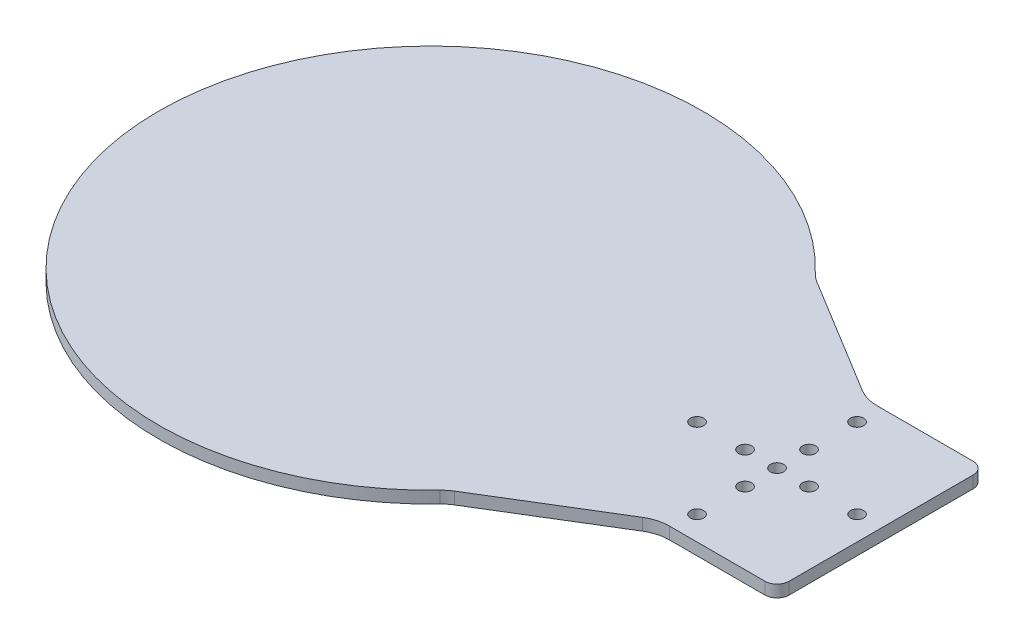
ISO-10303-21;
HEADER;
FILE_DESCRIPTION(('STEP AP214'),'2;1');
FILE_NAME('part.step','',(''),(''),'','','');
FILE_SCHEMA(('AUTOMOTIVE_DESIGN { 1 0 10303 214 1 1 1 1 }'));
ENDSEC;
DATA;
#1=APPLICATION_CONTEXT('core data for automotive mechanical design processes');
#2=APPLICATION_PROTOCOL_DEFINITION('international standard','automotive_design',2000,#1);
#3=PRODUCT_CONTEXT('',#1,'mechanical');
#4=PRODUCT('Part','Part','',(#3));
#5=PRODUCT_RELATED_PRODUCT_CATEGORY('part','',(#4));
#6=PRODUCT_DEFINITION_FORMATION('','',#4);
#7=PRODUCT_DEFINITION_CONTEXT('part definition',#1,'design');
#8=PRODUCT_DEFINITION('design','',#6,#7);
#9=PRODUCT_DEFINITION_SHAPE('','',#8);
#10=(LENGTH_UNIT() NAMED_UNIT(*) SI_UNIT(.MILLI.,.METRE.));
#11=(NAMED_UNIT(*) PLANE_ANGLE_UNIT() SI_UNIT($,.RADIAN.));
#12=(NAMED_UNIT(*) SI_UNIT($,.STERADIAN.) SOLID_ANGLE_UNIT());
#13=UNCERTAINTY_MEASURE_WITH_UNIT(LENGTH_MEASURE(1.E-05),#10,'distance_accuracy_value','');
#14=(GEOMETRIC_REPRESENTATION_CONTEXT(3) GLOBAL_UNCERTAINTY_ASSIGNED_CONTEXT((#13)) GLOBAL_UNIT_ASSIGNED_CONTEXT((#10,
#11,#12)) REPRESENTATION_CONTEXT('',''));
#15=CARTESIAN_POINT('',(0.,0.,0.));
#16=DIRECTION('',(0.,0.,1.));
#17=DIRECTION('',(1.,0.,0.));
#18=AXIS2_PLACEMENT_3D('',#15,#16,#17);
#19=CARTESIAN_POINT('',(0.,3.,0.));
#20=DIRECTION('',(0.,-1.,0.));
#21=DIRECTION('',(0.,0.,-1.));
#22=AXIS2_PLACEMENT_3D('',#19,#20,#21);
#23=CYLINDRICAL_SURFACE('',#22,68.);
#24=CARTESIAN_POINT('',(0.,0.,0.));
#25=DIRECTION('',(0.,1.,0.));
#26=DIRECTION('',(0.,0.,1.));
#27=AXIS2_PLACEMENT_3D('',#24,#25,#26);
#28=CIRCLE('',#27,68.);
#29=CARTESIAN_POINT('',(49.2133764276026,0.,-46.9259371839827));
#30=VERTEX_POINT('',#29);
#31=CARTESIAN_POINT('',(49.2133764276026,0.,46.9259371839827));
#32=VERTEX_POINT('',#31);
#33=EDGE_CURVE('E260',#30,#32,#28,.T.);
#34=ORIENTED_EDGE('',*,*,#33,.T.);
#35=DIRECTION('',(0.,-1.,0.));
#36=VECTOR('',#35,1.);
#37=CARTESIAN_POINT('',(49.2133764276026,3.,46.9259371839827));
#38=LINE('',#37,#36);
#39=CARTESIAN_POINT('',(49.2133764276026,3.,46.9259371839827));
#40=VERTEX_POINT('',#39);
#41=EDGE_CURVE('E186',#32,#40,#38,.F.);
#42=ORIENTED_EDGE('',*,*,#41,.T.);
#43=CARTESIAN_POINT('',(0.,3.,0.));
#44=DIRECTION('',(0.,1.,0.));
#45=DIRECTION('',(0.,0.,1.));
#46=AXIS2_PLACEMENT_3D('',#43,#44,#45);
#47=CIRCLE('',#46,68.);
#48=CARTESIAN_POINT('',(49.2133764276026,3.,-46.9259371839827));
#49=VERTEX_POINT('',#48);
#50=EDGE_CURVE('E145',#49,#40,#47,.T.);
#51=ORIENTED_EDGE('',*,*,#50,.F.);
#52=DIRECTION('',(0.,-1.,0.));
#53=VECTOR('',#52,1.);
#54=CARTESIAN_POINT('',(49.2133764276026,3.,-46.9259371839827));
#55=LINE('',#54,#53);
#56=EDGE_CURVE('E183',#49,#30,#55,.T.);
#57=ORIENTED_EDGE('',*,*,#56,.T.);
#58=EDGE_LOOP('',(#34,#42,#51,#57));
#59=FACE_BOUND('',#58,.T.);
#60=ADVANCED_FACE('F47',(#59),#23,.T.);
#61=CARTESIAN_POINT('',(62.83311228962,3.,-26.));
#62=DIRECTION('',(0.,0.,1.));
#63=DIRECTION('',(1.,0.,0.));
#64=AXIS2_PLACEMENT_3D('',#61,#62,#63);
#65=PLANE('',#64);
#66=DIRECTION('',(-1.,0.,0.));
#67=VECTOR('',#66,1.);
#68=CARTESIAN_POINT('',(62.83311228962,3.,-26.));
#69=LINE('',#68,#67);
#70=CARTESIAN_POINT('',(109.579,3.,-26.));
#71=VERTEX_POINT('',#70);
#72=CARTESIAN_POINT('',(85.6448705965521,3.,-26.));
#73=VERTEX_POINT('',#72);
#74=EDGE_CURVE('E169',#71,#73,#69,.T.);
#75=ORIENTED_EDGE('',*,*,#74,.F.);
#76=DIRECTION('',(0.,-1.,0.));
#77=VECTOR('',#76,1.);
#78=CARTESIAN_POINT('',(109.579,3.,-26.));
#79=LINE('',#78,#77);
#80=CARTESIAN_POINT('',(109.579,0.,-26.));
#81=VERTEX_POINT('',#80);
#82=EDGE_CURVE('E220',#71,#81,#79,.T.);
#83=ORIENTED_EDGE('',*,*,#82,.T.);
#84=DIRECTION('',(-1.,0.,0.));
#85=VECTOR('',#84,1.);
#86=CARTESIAN_POINT('',(62.83311228962,0.,-26.));
#87=LINE('',#86,#85);
#88=CARTESIAN_POINT('',(85.6448705965521,0.,-26.));
#89=VERTEX_POINT('',#88);
#90=EDGE_CURVE('E178',#81,#89,#87,.T.);
#91=ORIENTED_EDGE('',*,*,#90,.T.);
#92=DIRECTION('',(0.,1.,0.));
#93=VECTOR('',#92,1.);
#94=CARTESIAN_POINT('',(85.6448705965521,3.,-26.));
#95=LINE('',#94,#93);
#96=EDGE_CURVE('E196',#89,#73,#95,.T.);
#97=ORIENTED_EDGE('',*,*,#96,.T.);
#98=EDGE_LOOP('',(#75,#83,#91,#97));
#99=FACE_BOUND('',#98,.T.);
#100=ADVANCED_FACE('F245',(#99),#65,.F.);
#101=CARTESIAN_POINT('',(0.,3.,0.));
#102=DIRECTION('',(0.,1.,0.));
#103=DIRECTION('',(0.,0.,1.));
#104=AXIS2_PLACEMENT_3D('',#101,#102,#103);
#105=PLANE('',#104);
#106=DIRECTION('',(0.,0.,-1.));
#107=VECTOR('',#106,1.);
#108=CARTESIAN_POINT('',(112.579,3.,26.));
#109=LINE('',#108,#107);
#110=CARTESIAN_POINT('',(112.579,3.,23.));
#111=VERTEX_POINT('',#110);
#112=CARTESIAN_POINT('',(112.579,3.,-23.));
#113=VERTEX_POINT('',#112);
#114=EDGE_CURVE('E175',#111,#113,#109,.T.);
#115=ORIENTED_EDGE('',*,*,#114,.T.);
#116=CARTESIAN_POINT('',(109.579,3.,-23.));
#117=DIRECTION('',(0.,1.,0.));
#118=DIRECTION('',(0.,0.,1.));
#119=AXIS2_PLACEMENT_3D('',#116,#117,#118);
#120=CIRCLE('',#119,3.);
#121=EDGE_CURVE('E56',#113,#71,#120,.T.);
#122=ORIENTED_EDGE('',*,*,#121,.T.);
#123=ORIENTED_EDGE('',*,*,#74,.T.);
#124=CARTESIAN_POINT('',(85.6448705965521,3.,-36.));
#125=DIRECTION('',(0.,1.,0.));
#126=DIRECTION('',(0.,0.,1.));
#127=AXIS2_PLACEMENT_3D('',#124,#125,#126);
#128=CIRCLE('',#127,10.);
#129=CARTESIAN_POINT('',(80.4333741021672,3.,-27.4653468559634));
#130=VERTEX_POINT('',#129);
#131=EDGE_CURVE('E213',#73,#130,#128,.F.);
#132=ORIENTED_EDGE('',*,*,#131,.T.);
#133=DIRECTION('',(0.853465314403662,0.,0.521149649438488));
#134=VECTOR('',#133,1.);
#135=CARTESIAN_POINT('',(34.0615831304438,3.,-55.7812516747014));
#136=LINE('',#135,#134);
#137=CARTESIAN_POINT('',(51.2391411725711,3.,-45.2921571552377));
#138=VERTEX_POINT('',#137);
#139=EDGE_CURVE('E347',#138,#130,#136,.T.);
#140=ORIENTED_EDGE('',*,*,#139,.F.);
#141=CARTESIAN_POINT('',(56.4506376669559,3.,-53.8268102992743));
#142=DIRECTION('',(0.,1.,0.));
#143=DIRECTION('',(0.,0.,1.));
#144=AXIS2_PLACEMENT_3D('',#141,#142,#143);
#145=CIRCLE('',#144,10.);
#146=EDGE_CURVE('E207',#138,#49,#145,.F.);
#147=ORIENTED_EDGE('',*,*,#146,.T.);
#148=ORIENTED_EDGE('',*,*,#50,.T.);
#149=CARTESIAN_POINT('',(56.4506376669559,3.,53.8268102992743));
#150=DIRECTION('',(0.,1.,0.));
#151=DIRECTION('',(0.,0.,1.));
#152=AXIS2_PLACEMENT_3D('',#149,#150,#151);
#153=CIRCLE('',#152,10.);
#154=CARTESIAN_POINT('',(51.2391411725711,3.,45.2921571552377));
#155=VERTEX_POINT('',#154);
#156=EDGE_CURVE('E139',#40,#155,#153,.F.);
#157=ORIENTED_EDGE('',*,*,#156,.T.);
#158=DIRECTION('',(0.853465314403662,0.,-0.521149649438488));
#159=VECTOR('',#158,1.);
#160=CARTESIAN_POINT('',(34.0615831304438,3.,55.7812516747014));
#161=LINE('',#160,#159);
#162=CARTESIAN_POINT('',(80.4333741021672,3.,27.4653468559634));
#163=VERTEX_POINT('',#162);
#164=EDGE_CURVE('E143',#155,#163,#161,.T.);
#165=ORIENTED_EDGE('',*,*,#164,.T.);
#166=CARTESIAN_POINT('',(85.644870596552,3.,36.));
#167=DIRECTION('',(0.,1.,0.));
#168=DIRECTION('',(0.,0.,1.));
#169=AXIS2_PLACEMENT_3D('',#166,#167,#168);
#170=CIRCLE('',#169,10.);
#171=CARTESIAN_POINT('',(85.644870596552,3.,26.));
#172=VERTEX_POINT('',#171);
#173=EDGE_CURVE('E200',#163,#172,#170,.F.);
#174=ORIENTED_EDGE('',*,*,#173,.T.);
#175=DIRECTION('',(1.,0.,0.));
#176=VECTOR('',#175,1.);
#177=CARTESIAN_POINT('',(62.83311228962,3.,26.));
#178=LINE('',#177,#176);
#179=CARTESIAN_POINT('',(109.579,3.,26.));
#180=VERTEX_POINT('',#179);
#181=EDGE_CURVE('E269',#172,#180,#178,.T.);
#182=ORIENTED_EDGE('',*,*,#181,.T.);
#183=CARTESIAN_POINT('',(109.579,3.,23.));
#184=DIRECTION('',(0.,1.,0.));
#185=DIRECTION('',(0.,0.,1.));
#186=AXIS2_PLACEMENT_3D('',#183,#184,#185);
#187=CIRCLE('',#186,3.);
#188=EDGE_CURVE('E236',#180,#111,#187,.T.);
#189=ORIENTED_EDGE('',*,*,#188,.T.);
#190=EDGE_LOOP('',(#115,#122,#123,#132,#140,#147,#148,#157,#165,#174,#182,#189));
#191=FACE_BOUND('',#190,.T.);
#192=CARTESIAN_POINT('',(86.579,3.,-8.00000000000001));
#193=DIRECTION('',(0.,1.,0.));
#194=DIRECTION('',(0.,0.,1.));
#195=AXIS2_PLACEMENT_3D('',#192,#193,#194);
#196=CIRCLE('',#195,1.65);
#197=CARTESIAN_POINT('',(86.579,3.,-6.35));
#198=VERTEX_POINT('',#197);
#199=EDGE_CURVE('E326',#198,#198,#196,.T.);
#200=ORIENTED_EDGE('',*,*,#199,.F.);
#201=EDGE_LOOP('',(#200));
#202=FACE_BOUND('',#201,.T.);
#203=CARTESIAN_POINT('',(78.579,3.,0.));
#204=DIRECTION('',(0.,1.,0.));
#205=DIRECTION('',(0.,0.,1.));
#206=AXIS2_PLACEMENT_3D('',#203,#204,#205);
#207=CIRCLE('',#206,1.65);
#208=CARTESIAN_POINT('',(78.579,3.,1.65));
#209=VERTEX_POINT('',#208);
#210=EDGE_CURVE('E310',#209,#209,#207,.T.);
#211=ORIENTED_EDGE('',*,*,#210,.F.);
#212=EDGE_LOOP('',(#211));
#213=FACE_BOUND('',#212,.T.);
#214=CARTESIAN_POINT('',(86.579,3.,8.00000000000001));
#215=DIRECTION('',(0.,1.,0.));
#216=DIRECTION('',(0.,0.,1.));
#217=AXIS2_PLACEMENT_3D('',#214,#215,#216);
#218=CIRCLE('',#217,1.65);
#219=CARTESIAN_POINT('',(86.579,3.,9.65000000000001));
#220=VERTEX_POINT('',#219);
#221=EDGE_CURVE('E294',#220,#220,#218,.T.);
#222=ORIENTED_EDGE('',*,*,#221,.F.);
#223=EDGE_LOOP('',(#222));
#224=FACE_BOUND('',#223,.T.);
#225=CARTESIAN_POINT('',(94.579,3.,0.));
#226=DIRECTION('',(0.,1.,0.));
#227=DIRECTION('',(0.,0.,1.));
#228=AXIS2_PLACEMENT_3D('',#225,#226,#227);
#229=CIRCLE('',#228,1.65);
#230=CARTESIAN_POINT('',(94.579,3.,1.65));
#231=VERTEX_POINT('',#230);
#232=EDGE_CURVE('E278',#231,#231,#229,.T.);
#233=ORIENTED_EDGE('',*,*,#232,.F.);
#234=EDGE_LOOP('',(#233));
#235=FACE_BOUND('',#234,.T.);
#236=CARTESIAN_POINT('',(86.579,3.,0.));
#237=DIRECTION('',(0.,1.,0.));
#238=DIRECTION('',(0.,0.,1.));
#239=AXIS2_PLACEMENT_3D('',#236,#237,#238);
#240=CIRCLE('',#239,1.65);
#241=CARTESIAN_POINT('',(86.579,3.,1.65));
#242=VERTEX_POINT('',#241);
#243=EDGE_CURVE('E265',#242,#242,#240,.T.);
#244=ORIENTED_EDGE('',*,*,#243,.F.);
#245=EDGE_LOOP('',(#244));
#246=FACE_BOUND('',#245,.T.);
#247=CARTESIAN_POINT('',(106.579,3.,0.));
#248=DIRECTION('',(0.,1.,0.));
#249=DIRECTION('',(0.,0.,1.));
#250=AXIS2_PLACEMENT_3D('',#247,#248,#249);
#251=CIRCLE('',#250,1.65);
#252=CARTESIAN_POINT('',(106.579,3.,1.65));
#253=VERTEX_POINT('',#252);
#254=EDGE_CURVE('E286',#253,#253,#251,.T.);
#255=ORIENTED_EDGE('',*,*,#254,.F.);
#256=EDGE_LOOP('',(#255));
#257=FACE_BOUND('',#256,.T.);
#258=CARTESIAN_POINT('',(86.579,3.,20.));
#259=DIRECTION('',(0.,1.,0.));
#260=DIRECTION('',(0.,0.,1.));
#261=AXIS2_PLACEMENT_3D('',#258,#259,#260);
#262=CIRCLE('',#261,1.65);
#263=CARTESIAN_POINT('',(86.579,3.,21.65));
#264=VERTEX_POINT('',#263);
#265=EDGE_CURVE('E302',#264,#264,#262,.T.);
#266=ORIENTED_EDGE('',*,*,#265,.F.);
#267=EDGE_LOOP('',(#266));
#268=FACE_BOUND('',#267,.T.);
#269=CARTESIAN_POINT('',(66.579,3.,0.));
#270=DIRECTION('',(0.,1.,0.));
#271=DIRECTION('',(0.,0.,1.));
#272=AXIS2_PLACEMENT_3D('',#269,#270,#271);
#273=CIRCLE('',#272,1.65);
#274=CARTESIAN_POINT('',(66.579,3.,1.65));
#275=VERTEX_POINT('',#274);
#276=EDGE_CURVE('E318',#275,#275,#273,.T.);
#277=ORIENTED_EDGE('',*,*,#276,.F.);
#278=EDGE_LOOP('',(#277));
#279=FACE_BOUND('',#278,.T.);
#280=CARTESIAN_POINT('',(86.579,3.,-20.));
#281=DIRECTION('',(0.,1.,0.));
#282=DIRECTION('',(0.,0.,1.));
#283=AXIS2_PLACEMENT_3D('',#280,#281,#282);
#284=CIRCLE('',#283,1.65);
#285=CARTESIAN_POINT('',(86.579,3.,-18.35));
#286=VERTEX_POINT('',#285);
#287=EDGE_CURVE('E334',#286,#286,#284,.T.);
#288=ORIENTED_EDGE('',*,*,#287,.F.);
#289=EDGE_LOOP('',(#288));
#290=FACE_BOUND('',#289,.T.);
#291=ADVANCED_FACE('F141',(#191,#202,#213,#224,#235,#246,#257,#268,#279,#290),#105,.T.);
#292=CARTESIAN_POINT('',(0.,0.,0.));
#293=DIRECTION('',(0.,1.,0.));
#294=DIRECTION('',(0.,0.,1.));
#295=AXIS2_PLACEMENT_3D('',#292,#293,#294);
#296=PLANE('',#295);
#297=ORIENTED_EDGE('',*,*,#90,.F.);
#298=CARTESIAN_POINT('',(109.579,0.,-23.));
#299=DIRECTION('',(0.,1.,0.));
#300=DIRECTION('',(0.,0.,1.));
#301=AXIS2_PLACEMENT_3D('',#298,#299,#300);
#302=CIRCLE('',#301,3.);
#303=CARTESIAN_POINT('',(112.579,0.,-23.));
#304=VERTEX_POINT('',#303);
#305=EDGE_CURVE('E227',#81,#304,#302,.F.);
#306=ORIENTED_EDGE('',*,*,#305,.T.);
#307=DIRECTION('',(0.,0.,-1.));
#308=VECTOR('',#307,1.);
#309=CARTESIAN_POINT('',(112.579,0.,26.));
#310=LINE('',#309,#308);
#311=CARTESIAN_POINT('',(112.579,0.,23.));
#312=VERTEX_POINT('',#311);
#313=EDGE_CURVE('E253',#312,#304,#310,.T.);
#314=ORIENTED_EDGE('',*,*,#313,.F.);
#315=CARTESIAN_POINT('',(109.579,0.,23.));
#316=DIRECTION('',(0.,1.,0.));
#317=DIRECTION('',(0.,0.,1.));
#318=AXIS2_PLACEMENT_3D('',#315,#316,#317);
#319=CIRCLE('',#318,3.);
#320=CARTESIAN_POINT('',(109.579,0.,26.));
#321=VERTEX_POINT('',#320);
#322=EDGE_CURVE('E224',#312,#321,#319,.F.);
#323=ORIENTED_EDGE('',*,*,#322,.T.);
#324=DIRECTION('',(1.,0.,0.));
#325=VECTOR('',#324,1.);
#326=CARTESIAN_POINT('',(62.83311228962,0.,26.));
#327=LINE('',#326,#325);
#328=CARTESIAN_POINT('',(85.644870596552,0.,26.));
#329=VERTEX_POINT('',#328);
#330=EDGE_CURVE('E257',#329,#321,#327,.T.);
#331=ORIENTED_EDGE('',*,*,#330,.F.);
#332=CARTESIAN_POINT('',(85.644870596552,0.,36.));
#333=DIRECTION('',(0.,1.,0.));
#334=DIRECTION('',(0.,0.,1.));
#335=AXIS2_PLACEMENT_3D('',#332,#333,#334);
#336=CIRCLE('',#335,10.);
#337=CARTESIAN_POINT('',(80.4333741021672,0.,27.4653468559634));
#338=VERTEX_POINT('',#337);
#339=EDGE_CURVE('E152',#329,#338,#336,.T.);
#340=ORIENTED_EDGE('',*,*,#339,.T.);
#341=DIRECTION('',(0.853465314403662,0.,-0.521149649438488));
#342=VECTOR('',#341,1.);
#343=CARTESIAN_POINT('',(34.0615831304438,0.,55.7812516747014));
#344=LINE('',#343,#342);
#345=CARTESIAN_POINT('',(51.2391411725711,0.,45.2921571552377));
#346=VERTEX_POINT('',#345);
#347=EDGE_CURVE('E163',#346,#338,#344,.T.);
#348=ORIENTED_EDGE('',*,*,#347,.F.);
#349=CARTESIAN_POINT('',(56.4506376669559,0.,53.8268102992743));
#350=DIRECTION('',(0.,1.,0.));
#351=DIRECTION('',(0.,0.,1.));
#352=AXIS2_PLACEMENT_3D('',#349,#350,#351);
#353=CIRCLE('',#352,10.);
#354=EDGE_CURVE('E151',#346,#32,#353,.T.);
#355=ORIENTED_EDGE('',*,*,#354,.T.);
#356=ORIENTED_EDGE('',*,*,#33,.F.);
#357=CARTESIAN_POINT('',(56.4506376669559,0.,-53.8268102992743));
#358=DIRECTION('',(0.,1.,0.));
#359=DIRECTION('',(0.,0.,1.));
#360=AXIS2_PLACEMENT_3D('',#357,#358,#359);
#361=CIRCLE('',#360,10.);
#362=CARTESIAN_POINT('',(51.2391411725711,0.,-45.2921571552377));
#363=VERTEX_POINT('',#362);
#364=EDGE_CURVE('E210',#30,#363,#361,.T.);
#365=ORIENTED_EDGE('',*,*,#364,.T.);
#366=DIRECTION('',(0.853465314403662,0.,0.521149649438488));
#367=VECTOR('',#366,1.);
#368=CARTESIAN_POINT('',(34.0615831304438,0.,-55.7812516747014));
#369=LINE('',#368,#367);
#370=CARTESIAN_POINT('',(80.4333741021672,0.,-27.4653468559634));
#371=VERTEX_POINT('',#370);
#372=EDGE_CURVE('E164',#363,#371,#369,.T.);
#373=ORIENTED_EDGE('',*,*,#372,.T.);
#374=CARTESIAN_POINT('',(85.6448705965521,0.,-36.));
#375=DIRECTION('',(0.,1.,0.));
#376=DIRECTION('',(0.,0.,1.));
#377=AXIS2_PLACEMENT_3D('',#374,#375,#376);
#378=CIRCLE('',#377,10.);
#379=EDGE_CURVE('E216',#371,#89,#378,.T.);
#380=ORIENTED_EDGE('',*,*,#379,.T.);
#381=EDGE_LOOP('',(#297,#306,#314,#323,#331,#340,#348,#355,#356,#365,#373,#380));
#382=FACE_BOUND('',#381,.T.);
#383=CARTESIAN_POINT('',(86.579,0.,0.));
#384=DIRECTION('',(0.,1.,0.));
#385=DIRECTION('',(0.,0.,1.));
#386=AXIS2_PLACEMENT_3D('',#383,#384,#385);
#387=CIRCLE('',#386,1.65);
#388=CARTESIAN_POINT('',(86.579,0.,1.65));
#389=VERTEX_POINT('',#388);
#390=EDGE_CURVE('E274',#389,#389,#387,.T.);
#391=ORIENTED_EDGE('',*,*,#390,.T.);
#392=EDGE_LOOP('',(#391));
#393=FACE_BOUND('',#392,.T.);
#394=CARTESIAN_POINT('',(94.579,0.,0.));
#395=DIRECTION('',(0.,1.,0.));
#396=DIRECTION('',(0.,0.,1.));
#397=AXIS2_PLACEMENT_3D('',#394,#395,#396);
#398=CIRCLE('',#397,1.65);
#399=CARTESIAN_POINT('',(94.579,0.,1.65));
#400=VERTEX_POINT('',#399);
#401=EDGE_CURVE('E282',#400,#400,#398,.T.);
#402=ORIENTED_EDGE('',*,*,#401,.T.);
#403=EDGE_LOOP('',(#402));
#404=FACE_BOUND('',#403,.T.);
#405=CARTESIAN_POINT('',(106.579,0.,0.));
#406=DIRECTION('',(0.,1.,0.));
#407=DIRECTION('',(0.,0.,1.));
#408=AXIS2_PLACEMENT_3D('',#405,#406,#407);
#409=CIRCLE('',#408,1.65);
#410=CARTESIAN_POINT('',(106.579,0.,1.65));
#411=VERTEX_POINT('',#410);
#412=EDGE_CURVE('E290',#411,#411,#409,.T.);
#413=ORIENTED_EDGE('',*,*,#412,.T.);
#414=EDGE_LOOP('',(#413));
#415=FACE_BOUND('',#414,.T.);
#416=CARTESIAN_POINT('',(86.579,0.,8.00000000000001));
#417=DIRECTION('',(0.,1.,0.));
#418=DIRECTION('',(0.,0.,1.));
#419=AXIS2_PLACEMENT_3D('',#416,#417,#418);
#420=CIRCLE('',#419,1.65);
#421=CARTESIAN_POINT('',(86.579,0.,9.65000000000001));
#422=VERTEX_POINT('',#421);
#423=EDGE_CURVE('E298',#422,#422,#420,.T.);
#424=ORIENTED_EDGE('',*,*,#423,.T.);
#425=EDGE_LOOP('',(#424));
#426=FACE_BOUND('',#425,.T.);
#427=CARTESIAN_POINT('',(86.579,0.,20.));
#428=DIRECTION('',(0.,1.,0.));
#429=DIRECTION('',(0.,0.,1.));
#430=AXIS2_PLACEMENT_3D('',#427,#428,#429);
#431=CIRCLE('',#430,1.65);
#432=CARTESIAN_POINT('',(86.579,0.,21.65));
#433=VERTEX_POINT('',#432);
#434=EDGE_CURVE('E306',#433,#433,#431,.T.);
#435=ORIENTED_EDGE('',*,*,#434,.T.);
#436=EDGE_LOOP('',(#435));
#437=FACE_BOUND('',#436,.T.);
#438=CARTESIAN_POINT('',(78.579,0.,0.));
#439=DIRECTION('',(0.,1.,0.));
#440=DIRECTION('',(0.,0.,1.));
#441=AXIS2_PLACEMENT_3D('',#438,#439,#440);
#442=CIRCLE('',#441,1.65);
#443=CARTESIAN_POINT('',(78.579,0.,1.65));
#444=VERTEX_POINT('',#443);
#445=EDGE_CURVE('E314',#444,#444,#442,.T.);
#446=ORIENTED_EDGE('',*,*,#445,.T.);
#447=EDGE_LOOP('',(#446));
#448=FACE_BOUND('',#447,.T.);
#449=CARTESIAN_POINT('',(66.579,0.,0.));
#450=DIRECTION('',(0.,1.,0.));
#451=DIRECTION('',(0.,0.,1.));
#452=AXIS2_PLACEMENT_3D('',#449,#450,#451);
#453=CIRCLE('',#452,1.65);
#454=CARTESIAN_POINT('',(66.579,0.,1.65));
#455=VERTEX_POINT('',#454);
#456=EDGE_CURVE('E322',#455,#455,#453,.T.);
#457=ORIENTED_EDGE('',*,*,#456,.T.);
#458=EDGE_LOOP('',(#457));
#459=FACE_BOUND('',#458,.T.);
#460=CARTESIAN_POINT('',(86.579,0.,-8.00000000000001));
#461=DIRECTION('',(0.,1.,0.));
#462=DIRECTION('',(0.,0.,1.));
#463=AXIS2_PLACEMENT_3D('',#460,#461,#462);
#464=CIRCLE('',#463,1.65);
#465=CARTESIAN_POINT('',(86.579,0.,-6.35));
#466=VERTEX_POINT('',#465);
#467=EDGE_CURVE('E330',#466,#466,#464,.T.);
#468=ORIENTED_EDGE('',*,*,#467,.T.);
#469=EDGE_LOOP('',(#468));
#470=FACE_BOUND('',#469,.T.);
#471=CARTESIAN_POINT('',(86.579,0.,-20.));
#472=DIRECTION('',(0.,1.,0.));
#473=DIRECTION('',(0.,0.,1.));
#474=AXIS2_PLACEMENT_3D('',#471,#472,#473);
#475=CIRCLE('',#474,1.65);
#476=CARTESIAN_POINT('',(86.579,0.,-18.35));
#477=VERTEX_POINT('',#476);
#478=EDGE_CURVE('E338',#477,#477,#475,.T.);
#479=ORIENTED_EDGE('',*,*,#478,.T.);
#480=EDGE_LOOP('',(#479));
#481=FACE_BOUND('',#480,.T.);
#482=ADVANCED_FACE('F251',(#382,#393,#404,#415,#426,#437,#448,#459,#470,#481),#296,.F.);
#483=CARTESIAN_POINT('',(62.83311228962,3.,26.));
#484=DIRECTION('',(0.,0.,-1.));
#485=DIRECTION('',(-1.,0.,0.));
#486=AXIS2_PLACEMENT_3D('',#483,#484,#485);
#487=PLANE('',#486);
#488=ORIENTED_EDGE('',*,*,#330,.T.);
#489=DIRECTION('',(0.,-1.,0.));
#490=VECTOR('',#489,1.);
#491=CARTESIAN_POINT('',(109.579,3.,26.));
#492=LINE('',#491,#490);
#493=EDGE_CURVE('E11',#321,#180,#492,.F.);
#494=ORIENTED_EDGE('',*,*,#493,.T.);
#495=ORIENTED_EDGE('',*,*,#181,.F.);
#496=DIRECTION('',(0.,1.,0.));
#497=VECTOR('',#496,1.);
#498=CARTESIAN_POINT('',(85.644870596552,3.,26.));
#499=LINE('',#498,#497);
#500=EDGE_CURVE('E173',#172,#329,#499,.F.);
#501=ORIENTED_EDGE('',*,*,#500,.T.);
#502=EDGE_LOOP('',(#488,#494,#495,#501));
#503=FACE_BOUND('',#502,.T.);
#504=ADVANCED_FACE('F374',(#503),#487,.F.);
#505=CARTESIAN_POINT('',(112.579,3.,26.));
#506=DIRECTION('',(-1.,0.,0.));
#507=DIRECTION('',(0.,0.,1.));
#508=AXIS2_PLACEMENT_3D('',#505,#506,#507);
#509=PLANE('',#508);
#510=ORIENTED_EDGE('',*,*,#313,.T.);
#511=DIRECTION('',(0.,-1.,0.));
#512=VECTOR('',#511,1.);
#513=CARTESIAN_POINT('',(112.579,3.,-23.));
#514=LINE('',#513,#512);
#515=EDGE_CURVE('E69',#304,#113,#514,.F.);
#516=ORIENTED_EDGE('',*,*,#515,.T.);
#517=ORIENTED_EDGE('',*,*,#114,.F.);
#518=DIRECTION('',(0.,-1.,0.));
#519=VECTOR('',#518,1.);
#520=CARTESIAN_POINT('',(112.579,3.,23.));
#521=LINE('',#520,#519);
#522=EDGE_CURVE('E230',#111,#312,#521,.T.);
#523=ORIENTED_EDGE('',*,*,#522,.T.);
#524=EDGE_LOOP('',(#510,#516,#517,#523));
#525=FACE_BOUND('',#524,.T.);
#526=ADVANCED_FACE('F254',(#525),#509,.F.);
#527=CARTESIAN_POINT('',(86.579,3.,0.));
#528=DIRECTION('',(0.,-1.,0.));
#529=DIRECTION('',(0.,0.,-1.));
#530=AXIS2_PLACEMENT_3D('',#527,#528,#529);
#531=CYLINDRICAL_SURFACE('',#530,1.65);
#532=ORIENTED_EDGE('',*,*,#243,.T.);
#533=EDGE_LOOP('',(#532));
#534=FACE_BOUND('',#533,.T.);
#535=ORIENTED_EDGE('',*,*,#390,.F.);
#536=EDGE_LOOP('',(#535));
#537=FACE_BOUND('',#536,.T.);
#538=ADVANCED_FACE('F436',(#534,#537),#531,.F.);
#539=CARTESIAN_POINT('',(94.579,3.,0.));
#540=DIRECTION('',(0.,-1.,0.));
#541=DIRECTION('',(0.,0.,-1.));
#542=AXIS2_PLACEMENT_3D('',#539,#540,#541);
#543=CYLINDRICAL_SURFACE('',#542,1.65);
#544=ORIENTED_EDGE('',*,*,#232,.T.);
#545=EDGE_LOOP('',(#544));
#546=FACE_BOUND('',#545,.T.);
#547=ORIENTED_EDGE('',*,*,#401,.F.);
#548=EDGE_LOOP('',(#547));
#549=FACE_BOUND('',#548,.T.);
#550=ADVANCED_FACE('F504',(#546,#549),#543,.F.);
#551=CARTESIAN_POINT('',(106.579,3.,0.));
#552=DIRECTION('',(0.,-1.,0.));
#553=DIRECTION('',(0.,0.,-1.));
#554=AXIS2_PLACEMENT_3D('',#551,#552,#553);
#555=CYLINDRICAL_SURFACE('',#554,1.65);
#556=ORIENTED_EDGE('',*,*,#254,.T.);
#557=EDGE_LOOP('',(#556));
#558=FACE_BOUND('',#557,.T.);
#559=ORIENTED_EDGE('',*,*,#412,.F.);
#560=EDGE_LOOP('',(#559));
#561=FACE_BOUND('',#560,.T.);
#562=ADVANCED_FACE('F513',(#558,#561),#555,.F.);
#563=CARTESIAN_POINT('',(86.579,3.,8.00000000000001));
#564=DIRECTION('',(0.,-1.,0.));
#565=DIRECTION('',(0.,0.,-1.));
#566=AXIS2_PLACEMENT_3D('',#563,#564,#565);
#567=CYLINDRICAL_SURFACE('',#566,1.65);
#568=ORIENTED_EDGE('',*,*,#221,.T.);
#569=EDGE_LOOP('',(#568));
#570=FACE_BOUND('',#569,.T.);
#571=ORIENTED_EDGE('',*,*,#423,.F.);
#572=EDGE_LOOP('',(#571));
#573=FACE_BOUND('',#572,.T.);
#574=ADVANCED_FACE('F522',(#570,#573),#567,.F.);
#575=CARTESIAN_POINT('',(86.579,3.,20.));
#576=DIRECTION('',(0.,-1.,0.));
#577=DIRECTION('',(0.,0.,-1.));
#578=AXIS2_PLACEMENT_3D('',#575,#576,#577);
#579=CYLINDRICAL_SURFACE('',#578,1.65);
#580=ORIENTED_EDGE('',*,*,#265,.T.);
#581=EDGE_LOOP('',(#580));
#582=FACE_BOUND('',#581,.T.);
#583=ORIENTED_EDGE('',*,*,#434,.F.);
#584=EDGE_LOOP('',(#583));
#585=FACE_BOUND('',#584,.T.);
#586=ADVANCED_FACE('F531',(#582,#585),#579,.F.);
#587=CARTESIAN_POINT('',(78.579,3.,0.));
#588=DIRECTION('',(0.,-1.,0.));
#589=DIRECTION('',(0.,0.,-1.));
#590=AXIS2_PLACEMENT_3D('',#587,#588,#589);
#591=CYLINDRICAL_SURFACE('',#590,1.65);
#592=ORIENTED_EDGE('',*,*,#210,.T.);
#593=EDGE_LOOP('',(#592));
#594=FACE_BOUND('',#593,.T.);
#595=ORIENTED_EDGE('',*,*,#445,.F.);
#596=EDGE_LOOP('',(#595));
#597=FACE_BOUND('',#596,.T.);
#598=ADVANCED_FACE('F540',(#594,#597),#591,.F.);
#599=CARTESIAN_POINT('',(66.579,3.,0.));
#600=DIRECTION('',(0.,-1.,0.));
#601=DIRECTION('',(0.,0.,-1.));
#602=AXIS2_PLACEMENT_3D('',#599,#600,#601);
#603=CYLINDRICAL_SURFACE('',#602,1.65);
#604=ORIENTED_EDGE('',*,*,#276,.T.);
#605=EDGE_LOOP('',(#604));
#606=FACE_BOUND('',#605,.T.);
#607=ORIENTED_EDGE('',*,*,#456,.F.);
#608=EDGE_LOOP('',(#607));
#609=FACE_BOUND('',#608,.T.);
#610=ADVANCED_FACE('F549',(#606,#609),#603,.F.);
#611=CARTESIAN_POINT('',(86.579,3.,-8.00000000000001));
#612=DIRECTION('',(0.,-1.,0.));
#613=DIRECTION('',(0.,0.,-1.));
#614=AXIS2_PLACEMENT_3D('',#611,#612,#613);
#615=CYLINDRICAL_SURFACE('',#614,1.65);
#616=ORIENTED_EDGE('',*,*,#199,.T.);
#617=EDGE_LOOP('',(#616));
#618=FACE_BOUND('',#617,.T.);
#619=ORIENTED_EDGE('',*,*,#467,.F.);
#620=EDGE_LOOP('',(#619));
#621=FACE_BOUND('',#620,.T.);
#622=ADVANCED_FACE('F558',(#618,#621),#615,.F.);
#623=CARTESIAN_POINT('',(86.579,3.,-20.));
#624=DIRECTION('',(0.,-1.,0.));
#625=DIRECTION('',(0.,0.,-1.));
#626=AXIS2_PLACEMENT_3D('',#623,#624,#625);
#627=CYLINDRICAL_SURFACE('',#626,1.65);
#628=ORIENTED_EDGE('',*,*,#287,.T.);
#629=EDGE_LOOP('',(#628));
#630=FACE_BOUND('',#629,.T.);
#631=ORIENTED_EDGE('',*,*,#478,.F.);
#632=EDGE_LOOP('',(#631));
#633=FACE_BOUND('',#632,.T.);
#634=ADVANCED_FACE('F474',(#630,#633),#627,.F.);
#635=CARTESIAN_POINT('',(34.0615831304438,0.,55.7812516747014));
#636=DIRECTION('',(0.521149649438488,0.,0.853465314403662));
#637=DIRECTION('',(0.853465314403662,0.,-0.521149649438488));
#638=AXIS2_PLACEMENT_3D('',#635,#636,#637);
#639=PLANE('',#638);
#640=ORIENTED_EDGE('',*,*,#347,.T.);
#641=DIRECTION('',(0.,1.,0.));
#642=VECTOR('',#641,1.);
#643=CARTESIAN_POINT('',(80.4333741021672,0.,27.4653468559634));
#644=LINE('',#643,#642);
#645=EDGE_CURVE('E161',#338,#163,#644,.T.);
#646=ORIENTED_EDGE('',*,*,#645,.T.);
#647=ORIENTED_EDGE('',*,*,#164,.F.);
#648=DIRECTION('',(0.,-1.,0.));
#649=VECTOR('',#648,1.);
#650=CARTESIAN_POINT('',(51.2391411725711,0.,45.2921571552377));
#651=LINE('',#650,#649);
#652=EDGE_CURVE('E158',#155,#346,#651,.T.);
#653=ORIENTED_EDGE('',*,*,#652,.T.);
#654=EDGE_LOOP('',(#640,#646,#647,#653));
#655=FACE_BOUND('',#654,.T.);
#656=ADVANCED_FACE('F157',(#655),#639,.T.);
#657=CARTESIAN_POINT('',(34.0615831304438,0.,-55.7812516747014));
#658=DIRECTION('',(-0.521149649438488,0.,0.853465314403662));
#659=DIRECTION('',(0.853465314403662,0.,0.521149649438488));
#660=AXIS2_PLACEMENT_3D('',#657,#658,#659);
#661=PLANE('',#660);
#662=ORIENTED_EDGE('',*,*,#372,.F.);
#663=DIRECTION('',(0.,1.,0.));
#664=VECTOR('',#663,1.);
#665=CARTESIAN_POINT('',(51.2391411725711,3.,-45.2921571552377));
#666=LINE('',#665,#664);
#667=EDGE_CURVE('E192',#363,#138,#666,.T.);
#668=ORIENTED_EDGE('',*,*,#667,.T.);
#669=ORIENTED_EDGE('',*,*,#139,.T.);
#670=DIRECTION('',(0.,1.,0.));
#671=VECTOR('',#670,1.);
#672=CARTESIAN_POINT('',(80.4333741021672,0.,-27.4653468559634));
#673=LINE('',#672,#671);
#674=EDGE_CURVE('E189',#130,#371,#673,.F.);
#675=ORIENTED_EDGE('',*,*,#674,.T.);
#676=EDGE_LOOP('',(#662,#668,#669,#675));
#677=FACE_BOUND('',#676,.T.);
#678=ADVANCED_FACE('F363',(#677),#661,.F.);
#679=CARTESIAN_POINT('',(85.644870596552,0.,36.));
#680=DIRECTION('',(0.,1.,0.));
#681=DIRECTION('',(0.,0.,1.));
#682=AXIS2_PLACEMENT_3D('',#679,#680,#681);
#683=CYLINDRICAL_SURFACE('',#682,10.);
#684=ORIENTED_EDGE('',*,*,#339,.F.);
#685=ORIENTED_EDGE('',*,*,#500,.F.);
#686=ORIENTED_EDGE('',*,*,#173,.F.);
#687=ORIENTED_EDGE('',*,*,#645,.F.);
#688=EDGE_LOOP('',(#684,#685,#686,#687));
#689=FACE_BOUND('',#688,.T.);
#690=ADVANCED_FACE('F371',(#689),#683,.F.);
#691=CARTESIAN_POINT('',(56.4506376669559,3.,53.8268102992743));
#692=DIRECTION('',(0.,-1.,0.));
#693=DIRECTION('',(0.,0.,-1.));
#694=AXIS2_PLACEMENT_3D('',#691,#692,#693);
#695=CYLINDRICAL_SURFACE('',#694,10.);
#696=ORIENTED_EDGE('',*,*,#354,.F.);
#697=ORIENTED_EDGE('',*,*,#652,.F.);
#698=ORIENTED_EDGE('',*,*,#156,.F.);
#699=ORIENTED_EDGE('',*,*,#41,.F.);
#700=EDGE_LOOP('',(#696,#697,#698,#699));
#701=FACE_BOUND('',#700,.T.);
#702=ADVANCED_FACE('F167',(#701),#695,.F.);
#703=CARTESIAN_POINT('',(56.4506376669559,3.,-53.8268102992743));
#704=DIRECTION('',(0.,-1.,0.));
#705=DIRECTION('',(0.,0.,-1.));
#706=AXIS2_PLACEMENT_3D('',#703,#704,#705);
#707=CYLINDRICAL_SURFACE('',#706,10.);
#708=ORIENTED_EDGE('',*,*,#364,.F.);
#709=ORIENTED_EDGE('',*,*,#56,.F.);
#710=ORIENTED_EDGE('',*,*,#146,.F.);
#711=ORIENTED_EDGE('',*,*,#667,.F.);
#712=EDGE_LOOP('',(#708,#709,#710,#711));
#713=FACE_BOUND('',#712,.T.);
#714=ADVANCED_FACE('F365',(#713),#707,.F.);
#715=CARTESIAN_POINT('',(85.6448705965521,3.,-36.));
#716=DIRECTION('',(0.,-1.,0.));
#717=DIRECTION('',(0.,0.,-1.));
#718=AXIS2_PLACEMENT_3D('',#715,#716,#717);
#719=CYLINDRICAL_SURFACE('',#718,10.);
#720=ORIENTED_EDGE('',*,*,#379,.F.);
#721=ORIENTED_EDGE('',*,*,#674,.F.);
#722=ORIENTED_EDGE('',*,*,#131,.F.);
#723=ORIENTED_EDGE('',*,*,#96,.F.);
#724=EDGE_LOOP('',(#720,#721,#722,#723));
#725=FACE_BOUND('',#724,.T.);
#726=ADVANCED_FACE('F361',(#725),#719,.F.);
#727=CARTESIAN_POINT('',(109.579,3.,-23.));
#728=DIRECTION('',(0.,-1.,0.));
#729=DIRECTION('',(0.,0.,-1.));
#730=AXIS2_PLACEMENT_3D('',#727,#728,#729);
#731=CYLINDRICAL_SURFACE('',#730,3.);
#732=ORIENTED_EDGE('',*,*,#121,.F.);
#733=ORIENTED_EDGE('',*,*,#515,.F.);
#734=ORIENTED_EDGE('',*,*,#305,.F.);
#735=ORIENTED_EDGE('',*,*,#82,.F.);
#736=EDGE_LOOP('',(#732,#733,#734,#735));
#737=FACE_BOUND('',#736,.T.);
#738=ADVANCED_FACE('F248',(#737),#731,.T.);
#739=CARTESIAN_POINT('',(109.579,3.,23.));
#740=DIRECTION('',(0.,-1.,0.));
#741=DIRECTION('',(0.,0.,-1.));
#742=AXIS2_PLACEMENT_3D('',#739,#740,#741);
#743=CYLINDRICAL_SURFACE('',#742,3.);
#744=ORIENTED_EDGE('',*,*,#188,.F.);
#745=ORIENTED_EDGE('',*,*,#493,.F.);
#746=ORIENTED_EDGE('',*,*,#322,.F.);
#747=ORIENTED_EDGE('',*,*,#522,.F.);
#748=EDGE_LOOP('',(#744,#745,#746,#747));
#749=FACE_BOUND('',#748,.T.);
#750=ADVANCED_FACE('F49',(#749),#743,.T.);
#751=CLOSED_SHELL('',(#60,#100,#291,#482,#504,#526,#538,#550,#562,#574,#586,#598,#610,#622,#634,
#656,#678,#690,#702,#714,#726,#738,#750));
#752=MANIFOLD_SOLID_BREP('B2',#751);
#753=ADVANCED_BREP_SHAPE_REPRESENTATION('',(#18,#752),#14);
#754=SHAPE_DEFINITION_REPRESENTATION(#9,#753);
ENDSEC;
END-ISO-10303-21;
